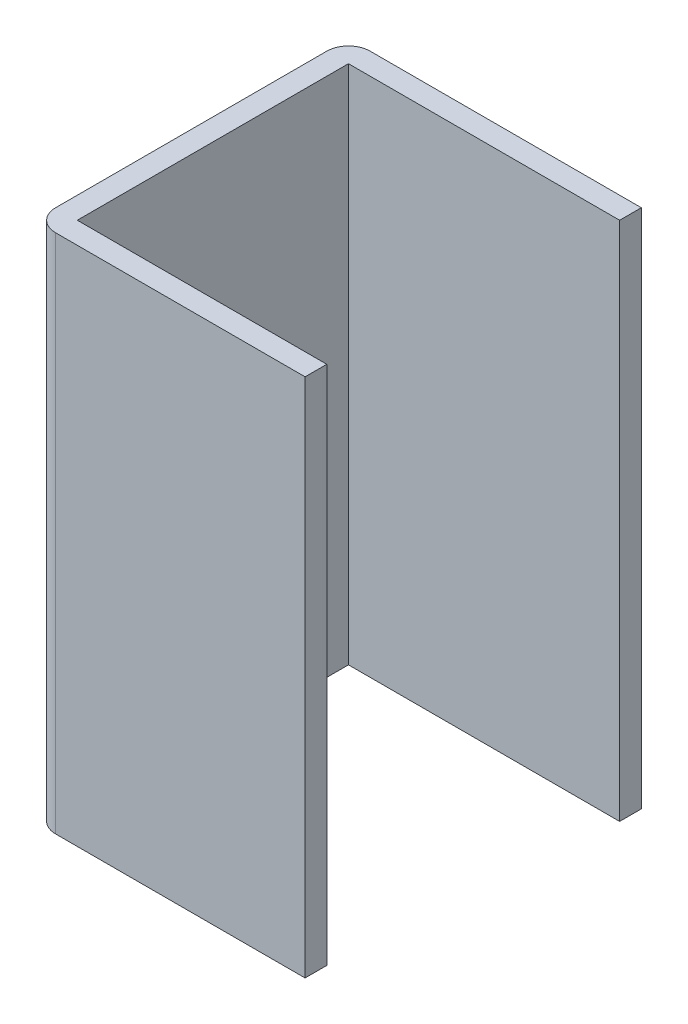
ISO-10303-21;
HEADER;
FILE_DESCRIPTION(('STEP AP214'),'2;1');
FILE_NAME('part.step','',(''),(''),'','','');
FILE_SCHEMA(('AUTOMOTIVE_DESIGN { 1 0 10303 214 1 1 1 1 }'));
ENDSEC;
DATA;
#1=APPLICATION_CONTEXT('core data for automotive mechanical design processes');
#2=APPLICATION_PROTOCOL_DEFINITION('international standard','automotive_design',2000,#1);
#3=PRODUCT_CONTEXT('',#1,'mechanical');
#4=PRODUCT('Part','Part','',(#3));
#5=PRODUCT_RELATED_PRODUCT_CATEGORY('part','',(#4));
#6=PRODUCT_DEFINITION_FORMATION('','',#4);
#7=PRODUCT_DEFINITION_CONTEXT('part definition',#1,'design');
#8=PRODUCT_DEFINITION('design','',#6,#7);
#9=PRODUCT_DEFINITION_SHAPE('','',#8);
#10=(LENGTH_UNIT() NAMED_UNIT(*) SI_UNIT(.MILLI.,.METRE.));
#11=(NAMED_UNIT(*) PLANE_ANGLE_UNIT() SI_UNIT($,.RADIAN.));
#12=(NAMED_UNIT(*) SI_UNIT($,.STERADIAN.) SOLID_ANGLE_UNIT());
#13=UNCERTAINTY_MEASURE_WITH_UNIT(LENGTH_MEASURE(1.E-05),#10,'distance_accuracy_value','');
#14=(GEOMETRIC_REPRESENTATION_CONTEXT(3) GLOBAL_UNCERTAINTY_ASSIGNED_CONTEXT((#13)) GLOBAL_UNIT_ASSIGNED_CONTEXT((#10,
#11,#12)) REPRESENTATION_CONTEXT('',''));
#15=CARTESIAN_POINT('',(0.,0.,0.));
#16=DIRECTION('',(0.,0.,1.));
#17=DIRECTION('',(1.,0.,0.));
#18=AXIS2_PLACEMENT_3D('',#15,#16,#17);
#19=CARTESIAN_POINT('',(-3.55,-1.2,0.));
#20=DIRECTION('',(1.,0.,0.));
#21=DIRECTION('',(0.,0.,-1.));
#22=AXIS2_PLACEMENT_3D('',#19,#20,#21);
#23=PLANE('',#22);
#24=DIRECTION('',(0.,0.,-1.));
#25=VECTOR('',#24,1.);
#26=CARTESIAN_POINT('',(-3.55,1.2,0.));
#27=LINE('',#26,#25);
#28=CARTESIAN_POINT('',(-3.55,1.2,0.1));
#29=VERTEX_POINT('',#28);
#30=CARTESIAN_POINT('',(-3.55,1.2,1.35));
#31=VERTEX_POINT('',#30);
#32=EDGE_CURVE('E191',#29,#31,#27,.F.);
#33=ORIENTED_EDGE('',*,*,#32,.T.);
#34=DIRECTION('',(0.,1.,0.));
#35=VECTOR('',#34,1.);
#36=CARTESIAN_POINT('',(-3.55,-1.2,1.35));
#37=LINE('',#36,#35);
#38=CARTESIAN_POINT('',(-3.55,-1.2,1.35));
#39=VERTEX_POINT('',#38);
#40=EDGE_CURVE('E180',#31,#39,#37,.F.);
#41=ORIENTED_EDGE('',*,*,#40,.T.);
#42=DIRECTION('',(0.,0.,-1.));
#43=VECTOR('',#42,1.);
#44=CARTESIAN_POINT('',(-3.55,-1.2,0.));
#45=LINE('',#44,#43);
#46=CARTESIAN_POINT('',(-3.55,-1.2,0.1));
#47=VERTEX_POINT('',#46);
#48=EDGE_CURVE('E204',#39,#47,#45,.T.);
#49=ORIENTED_EDGE('',*,*,#48,.T.);
#50=DIRECTION('',(0.,1.,0.));
#51=VECTOR('',#50,1.);
#52=CARTESIAN_POINT('',(-3.55,-1.2,0.1));
#53=LINE('',#52,#51);
#54=EDGE_CURVE('E190',#29,#47,#53,.F.);
#55=ORIENTED_EDGE('',*,*,#54,.F.);
#56=EDGE_LOOP('',(#33,#41,#49,#55));
#57=FACE_BOUND('',#56,.T.);
#58=ADVANCED_FACE('F17',(#57),#23,.T.);
#59=CARTESIAN_POINT('',(-3.65,-1.2,0.1));
#60=DIRECTION('',(0.,0.,1.));
#61=DIRECTION('',(1.,0.,0.));
#62=AXIS2_PLACEMENT_3D('',#59,#60,#61);
#63=PLANE('',#62);
#64=DIRECTION('',(1.,0.,0.));
#65=VECTOR('',#64,1.);
#66=CARTESIAN_POINT('',(-3.65,-1.2,0.1));
#67=LINE('',#66,#65);
#68=CARTESIAN_POINT('',(-2.3,-1.2,0.1));
#69=VERTEX_POINT('',#68);
#70=EDGE_CURVE('E181',#47,#69,#67,.T.);
#71=ORIENTED_EDGE('',*,*,#70,.T.);
#72=DIRECTION('',(0.,1.,0.));
#73=VECTOR('',#72,1.);
#74=CARTESIAN_POINT('',(-2.3,-1.2,0.1));
#75=LINE('',#74,#73);
#76=CARTESIAN_POINT('',(-2.3,1.2,0.1));
#77=VERTEX_POINT('',#76);
#78=EDGE_CURVE('E162',#77,#69,#75,.F.);
#79=ORIENTED_EDGE('',*,*,#78,.F.);
#80=DIRECTION('',(1.,0.,0.));
#81=VECTOR('',#80,1.);
#82=CARTESIAN_POINT('',(-3.65,1.2,0.1));
#83=LINE('',#82,#81);
#84=EDGE_CURVE('E188',#77,#29,#83,.F.);
#85=ORIENTED_EDGE('',*,*,#84,.T.);
#86=ORIENTED_EDGE('',*,*,#54,.T.);
#87=EDGE_LOOP('',(#71,#79,#85,#86));
#88=FACE_BOUND('',#87,.T.);
#89=ADVANCED_FACE('F232',(#88),#63,.T.);
#90=CARTESIAN_POINT('',(-3.65,-1.2,1.35));
#91=DIRECTION('',(0.,0.,1.));
#92=DIRECTION('',(1.,0.,0.));
#93=AXIS2_PLACEMENT_3D('',#90,#91,#92);
#94=PLANE('',#93);
#95=DIRECTION('',(1.,0.,0.));
#96=VECTOR('',#95,1.);
#97=CARTESIAN_POINT('',(-3.65,-1.2,1.35));
#98=LINE('',#97,#96);
#99=CARTESIAN_POINT('',(-2.4,-1.2,1.35));
#100=VERTEX_POINT('',#99);
#101=EDGE_CURVE('E169',#39,#100,#98,.T.);
#102=ORIENTED_EDGE('',*,*,#101,.F.);
#103=ORIENTED_EDGE('',*,*,#40,.F.);
#104=DIRECTION('',(1.,0.,0.));
#105=VECTOR('',#104,1.);
#106=CARTESIAN_POINT('',(-3.65,1.2,1.35));
#107=LINE('',#106,#105);
#108=CARTESIAN_POINT('',(-2.4,1.2,1.35));
#109=VERTEX_POINT('',#108);
#110=EDGE_CURVE('E178',#109,#31,#107,.F.);
#111=ORIENTED_EDGE('',*,*,#110,.F.);
#112=DIRECTION('',(0.,1.,0.));
#113=VECTOR('',#112,1.);
#114=CARTESIAN_POINT('',(-2.4,-1.2,1.35));
#115=LINE('',#114,#113);
#116=EDGE_CURVE('E112',#100,#109,#115,.T.);
#117=ORIENTED_EDGE('',*,*,#116,.F.);
#118=EDGE_LOOP('',(#102,#103,#111,#117));
#119=FACE_BOUND('',#118,.T.);
#120=ADVANCED_FACE('F239',(#119),#94,.F.);
#121=CARTESIAN_POINT('',(-2.3,-1.2,0.));
#122=DIRECTION('',(1.,0.,0.));
#123=DIRECTION('',(0.,0.,-1.));
#124=AXIS2_PLACEMENT_3D('',#121,#122,#123);
#125=PLANE('',#124);
#126=DIRECTION('',(0.,0.,-1.));
#127=VECTOR('',#126,1.);
#128=CARTESIAN_POINT('',(-2.3,1.2,0.));
#129=LINE('',#128,#127);
#130=CARTESIAN_POINT('',(-2.3,1.2,0.));
#131=VERTEX_POINT('',#130);
#132=EDGE_CURVE('E168',#131,#77,#129,.F.);
#133=ORIENTED_EDGE('',*,*,#132,.T.);
#134=ORIENTED_EDGE('',*,*,#78,.T.);
#135=DIRECTION('',(0.,0.,-1.));
#136=VECTOR('',#135,1.);
#137=CARTESIAN_POINT('',(-2.3,-1.2,0.));
#138=LINE('',#137,#136);
#139=CARTESIAN_POINT('',(-2.3,-1.2,0.));
#140=VERTEX_POINT('',#139);
#141=EDGE_CURVE('E61',#69,#140,#138,.T.);
#142=ORIENTED_EDGE('',*,*,#141,.T.);
#143=DIRECTION('',(0.,1.,0.));
#144=VECTOR('',#143,1.);
#145=CARTESIAN_POINT('',(-2.3,-1.2,0.));
#146=LINE('',#145,#144);
#147=EDGE_CURVE('E123',#140,#131,#146,.T.);
#148=ORIENTED_EDGE('',*,*,#147,.T.);
#149=EDGE_LOOP('',(#133,#134,#142,#148));
#150=FACE_BOUND('',#149,.T.);
#151=ADVANCED_FACE('F234',(#150),#125,.T.);
#152=CARTESIAN_POINT('',(-2.4,-1.2,1.35));
#153=DIRECTION('',(1.,0.,0.));
#154=DIRECTION('',(0.,0.,-1.));
#155=AXIS2_PLACEMENT_3D('',#152,#153,#154);
#156=PLANE('',#155);
#157=DIRECTION('',(0.,0.,-1.));
#158=VECTOR('',#157,1.);
#159=CARTESIAN_POINT('',(-2.4,1.2,1.35));
#160=LINE('',#159,#158);
#161=CARTESIAN_POINT('',(-2.4,1.2,1.45));
#162=VERTEX_POINT('',#161);
#163=EDGE_CURVE('E107',#109,#162,#160,.F.);
#164=ORIENTED_EDGE('',*,*,#163,.T.);
#165=DIRECTION('',(0.,1.,0.));
#166=VECTOR('',#165,1.);
#167=CARTESIAN_POINT('',(-2.4,-1.2,1.45));
#168=LINE('',#167,#166);
#169=CARTESIAN_POINT('',(-2.4,-1.2,1.45));
#170=VERTEX_POINT('',#169);
#171=EDGE_CURVE('E110',#170,#162,#168,.T.);
#172=ORIENTED_EDGE('',*,*,#171,.F.);
#173=DIRECTION('',(0.,0.,-1.));
#174=VECTOR('',#173,1.);
#175=CARTESIAN_POINT('',(-2.4,-1.2,1.35));
#176=LINE('',#175,#174);
#177=EDGE_CURVE('E160',#170,#100,#176,.T.);
#178=ORIENTED_EDGE('',*,*,#177,.T.);
#179=ORIENTED_EDGE('',*,*,#116,.T.);
#180=EDGE_LOOP('',(#164,#172,#178,#179));
#181=FACE_BOUND('',#180,.T.);
#182=ADVANCED_FACE('F109',(#181),#156,.T.);
#183=CARTESIAN_POINT('',(-3.65,-1.2,0.));
#184=DIRECTION('',(0.,0.,1.));
#185=DIRECTION('',(1.,0.,0.));
#186=AXIS2_PLACEMENT_3D('',#183,#184,#185);
#187=PLANE('',#186);
#188=DIRECTION('',(1.,0.,0.));
#189=VECTOR('',#188,1.);
#190=CARTESIAN_POINT('',(-3.174050632911,-1.2,0.));
#191=LINE('',#190,#189);
#192=CARTESIAN_POINT('',(-3.55,-1.2,0.));
#193=VERTEX_POINT('',#192);
#194=EDGE_CURVE('E143',#193,#140,#191,.T.);
#195=ORIENTED_EDGE('',*,*,#194,.F.);
#196=DIRECTION('',(0.,1.,0.));
#197=VECTOR('',#196,1.);
#198=CARTESIAN_POINT('',(-3.55,-1.2,0.));
#199=LINE('',#198,#197);
#200=CARTESIAN_POINT('',(-3.55,1.2,0.));
#201=VERTEX_POINT('',#200);
#202=EDGE_CURVE('E52',#201,#193,#199,.F.);
#203=ORIENTED_EDGE('',*,*,#202,.F.);
#204=DIRECTION('',(1.,0.,0.));
#205=VECTOR('',#204,1.);
#206=CARTESIAN_POINT('',(-3.65,1.2,0.));
#207=LINE('',#206,#205);
#208=EDGE_CURVE('E116',#131,#201,#207,.F.);
#209=ORIENTED_EDGE('',*,*,#208,.F.);
#210=ORIENTED_EDGE('',*,*,#147,.F.);
#211=EDGE_LOOP('',(#195,#203,#209,#210));
#212=FACE_BOUND('',#211,.T.);
#213=ADVANCED_FACE('F227',(#212),#187,.F.);
#214=CARTESIAN_POINT('',(-3.65,-1.2,1.45));
#215=DIRECTION('',(0.,0.,1.));
#216=DIRECTION('',(1.,0.,0.));
#217=AXIS2_PLACEMENT_3D('',#214,#215,#216);
#218=PLANE('',#217);
#219=DIRECTION('',(1.,0.,0.));
#220=VECTOR('',#219,1.);
#221=CARTESIAN_POINT('',(-3.174050632911,-1.2,1.45));
#222=LINE('',#221,#220);
#223=CARTESIAN_POINT('',(-3.55,-1.2,1.45));
#224=VERTEX_POINT('',#223);
#225=EDGE_CURVE('E99',#170,#224,#222,.F.);
#226=ORIENTED_EDGE('',*,*,#225,.F.);
#227=ORIENTED_EDGE('',*,*,#171,.T.);
#228=DIRECTION('',(-1.,0.,0.));
#229=VECTOR('',#228,1.);
#230=CARTESIAN_POINT('',(-3.174050632911,1.2,1.45));
#231=LINE('',#230,#229);
#232=CARTESIAN_POINT('',(-3.55,1.2,1.45));
#233=VERTEX_POINT('',#232);
#234=EDGE_CURVE('E122',#233,#162,#231,.F.);
#235=ORIENTED_EDGE('',*,*,#234,.F.);
#236=DIRECTION('',(0.,1.,0.));
#237=VECTOR('',#236,1.);
#238=CARTESIAN_POINT('',(-3.55,-1.2,1.45));
#239=LINE('',#238,#237);
#240=EDGE_CURVE('E128',#224,#233,#239,.T.);
#241=ORIENTED_EDGE('',*,*,#240,.F.);
#242=EDGE_LOOP('',(#226,#227,#235,#241));
#243=FACE_BOUND('',#242,.T.);
#244=ADVANCED_FACE('F120',(#243),#218,.T.);
#245=CARTESIAN_POINT('',(-3.174050632911,-1.2,0.707911392405));
#246=DIRECTION('',(0.,-1.,0.));
#247=DIRECTION('',(0.,0.,-1.));
#248=AXIS2_PLACEMENT_3D('',#245,#246,#247);
#249=PLANE('',#248);
#250=ORIENTED_EDGE('',*,*,#101,.T.);
#251=ORIENTED_EDGE('',*,*,#177,.F.);
#252=ORIENTED_EDGE('',*,*,#225,.T.);
#253=CARTESIAN_POINT('',(-3.55,-1.2,1.35));
#254=DIRECTION('',(0.,1.,0.));
#255=DIRECTION('',(0.,0.,1.));
#256=AXIS2_PLACEMENT_3D('',#253,#254,#255);
#257=CIRCLE('',#256,0.1);
#258=CARTESIAN_POINT('',(-3.65,-1.2,1.35));
#259=VERTEX_POINT('',#258);
#260=EDGE_CURVE('E142',#259,#224,#257,.T.);
#261=ORIENTED_EDGE('',*,*,#260,.F.);
#262=DIRECTION('',(0.,0.,-1.));
#263=VECTOR('',#262,1.);
#264=CARTESIAN_POINT('',(-3.65,-1.2,0.));
#265=LINE('',#264,#263);
#266=CARTESIAN_POINT('',(-3.65,-1.2,0.1));
#267=VERTEX_POINT('',#266);
#268=EDGE_CURVE('E138',#259,#267,#265,.T.);
#269=ORIENTED_EDGE('',*,*,#268,.T.);
#270=CARTESIAN_POINT('',(-3.55,-1.2,0.1));
#271=DIRECTION('',(0.,1.,0.));
#272=DIRECTION('',(0.,0.,1.));
#273=AXIS2_PLACEMENT_3D('',#270,#271,#272);
#274=CIRCLE('',#273,0.1);
#275=EDGE_CURVE('E20',#193,#267,#274,.T.);
#276=ORIENTED_EDGE('',*,*,#275,.F.);
#277=ORIENTED_EDGE('',*,*,#194,.T.);
#278=ORIENTED_EDGE('',*,*,#141,.F.);
#279=ORIENTED_EDGE('',*,*,#70,.F.);
#280=ORIENTED_EDGE('',*,*,#48,.F.);
#281=EDGE_LOOP('',(#250,#251,#252,#261,#269,#276,#277,#278,#279,#280));
#282=FACE_BOUND('',#281,.T.);
#283=ADVANCED_FACE('F217',(#282),#249,.T.);
#284=CARTESIAN_POINT('',(-3.55,-1.2,0.1));
#285=DIRECTION('',(0.,1.,0.));
#286=DIRECTION('',(0.,0.,1.));
#287=AXIS2_PLACEMENT_3D('',#284,#285,#286);
#288=CYLINDRICAL_SURFACE('',#287,0.1);
#289=ORIENTED_EDGE('',*,*,#202,.T.);
#290=ORIENTED_EDGE('',*,*,#275,.T.);
#291=DIRECTION('',(0.,1.,0.));
#292=VECTOR('',#291,1.);
#293=CARTESIAN_POINT('',(-3.65,-1.2,0.1));
#294=LINE('',#293,#292);
#295=CARTESIAN_POINT('',(-3.65,1.2,0.1));
#296=VERTEX_POINT('',#295);
#297=EDGE_CURVE('E135',#267,#296,#294,.T.);
#298=ORIENTED_EDGE('',*,*,#297,.T.);
#299=CARTESIAN_POINT('',(-3.55,1.2,0.1));
#300=DIRECTION('',(0.,1.,0.));
#301=DIRECTION('',(0.,0.,1.));
#302=AXIS2_PLACEMENT_3D('',#299,#300,#301);
#303=CIRCLE('',#302,0.1);
#304=EDGE_CURVE('E129',#201,#296,#303,.T.);
#305=ORIENTED_EDGE('',*,*,#304,.F.);
#306=EDGE_LOOP('',(#289,#290,#298,#305));
#307=FACE_BOUND('',#306,.T.);
#308=ADVANCED_FACE('F223',(#307),#288,.T.);
#309=CARTESIAN_POINT('',(-3.174050632911,1.2,0.707911392405));
#310=DIRECTION('',(0.,1.,0.));
#311=DIRECTION('',(-1.,0.,0.));
#312=AXIS2_PLACEMENT_3D('',#309,#310,#311);
#313=PLANE('',#312);
#314=ORIENTED_EDGE('',*,*,#84,.F.);
#315=ORIENTED_EDGE('',*,*,#132,.F.);
#316=ORIENTED_EDGE('',*,*,#208,.T.);
#317=ORIENTED_EDGE('',*,*,#304,.T.);
#318=DIRECTION('',(0.,0.,-1.));
#319=VECTOR('',#318,1.);
#320=CARTESIAN_POINT('',(-3.65,1.2,0.));
#321=LINE('',#320,#319);
#322=CARTESIAN_POINT('',(-3.65,1.2,1.35));
#323=VERTEX_POINT('',#322);
#324=EDGE_CURVE('E26',#296,#323,#321,.F.);
#325=ORIENTED_EDGE('',*,*,#324,.T.);
#326=CARTESIAN_POINT('',(-3.55,1.2,1.35));
#327=DIRECTION('',(0.,1.,0.));
#328=DIRECTION('',(0.,0.,1.));
#329=AXIS2_PLACEMENT_3D('',#326,#327,#328);
#330=CIRCLE('',#329,0.1);
#331=EDGE_CURVE('E34',#233,#323,#330,.F.);
#332=ORIENTED_EDGE('',*,*,#331,.F.);
#333=ORIENTED_EDGE('',*,*,#234,.T.);
#334=ORIENTED_EDGE('',*,*,#163,.F.);
#335=ORIENTED_EDGE('',*,*,#110,.T.);
#336=ORIENTED_EDGE('',*,*,#32,.F.);
#337=EDGE_LOOP('',(#314,#315,#316,#317,#325,#332,#333,#334,#335,#336));
#338=FACE_BOUND('',#337,.T.);
#339=ADVANCED_FACE('F126',(#338),#313,.T.);
#340=CARTESIAN_POINT('',(-3.55,-1.2,1.35));
#341=DIRECTION('',(0.,1.,0.));
#342=DIRECTION('',(0.,0.,1.));
#343=AXIS2_PLACEMENT_3D('',#340,#341,#342);
#344=CYLINDRICAL_SURFACE('',#343,0.1);
#345=DIRECTION('',(0.,1.,0.));
#346=VECTOR('',#345,1.);
#347=CARTESIAN_POINT('',(-3.65,-1.2,1.35));
#348=LINE('',#347,#346);
#349=EDGE_CURVE('E11',#323,#259,#348,.F.);
#350=ORIENTED_EDGE('',*,*,#349,.T.);
#351=ORIENTED_EDGE('',*,*,#260,.T.);
#352=ORIENTED_EDGE('',*,*,#240,.T.);
#353=ORIENTED_EDGE('',*,*,#331,.T.);
#354=EDGE_LOOP('',(#350,#351,#352,#353));
#355=FACE_BOUND('',#354,.T.);
#356=ADVANCED_FACE('F216',(#355),#344,.T.);
#357=CARTESIAN_POINT('',(-3.65,-1.2,0.));
#358=DIRECTION('',(1.,0.,0.));
#359=DIRECTION('',(0.,0.,-1.));
#360=AXIS2_PLACEMENT_3D('',#357,#358,#359);
#361=PLANE('',#360);
#362=ORIENTED_EDGE('',*,*,#324,.F.);
#363=ORIENTED_EDGE('',*,*,#297,.F.);
#364=ORIENTED_EDGE('',*,*,#268,.F.);
#365=ORIENTED_EDGE('',*,*,#349,.F.);
#366=EDGE_LOOP('',(#362,#363,#364,#365));
#367=FACE_BOUND('',#366,.T.);
#368=ADVANCED_FACE('F222',(#367),#361,.F.);
#369=CLOSED_SHELL('',(#58,#89,#120,#151,#182,#213,#244,#283,#308,#339,#356,#368));
#370=MANIFOLD_SOLID_BREP('B1',#369);
#371=ADVANCED_BREP_SHAPE_REPRESENTATION('',(#18,#370),#14);
#372=SHAPE_DEFINITION_REPRESENTATION(#9,#371);
ENDSEC;
END-ISO-10303-21;
